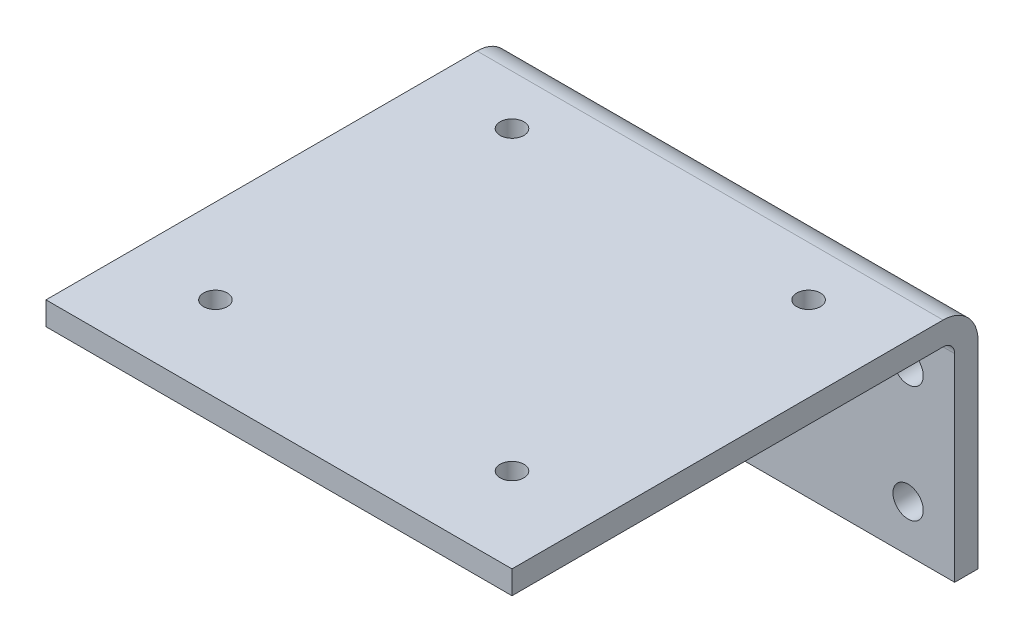
ISO-10303-21;
HEADER;
FILE_DESCRIPTION(('STEP AP214'),'2;1');
FILE_NAME('part.step','',(''),(''),'','','');
FILE_SCHEMA(('AUTOMOTIVE_DESIGN { 1 0 10303 214 1 1 1 1 }'));
ENDSEC;
DATA;
#1=APPLICATION_CONTEXT('core data for automotive mechanical design processes');
#2=APPLICATION_PROTOCOL_DEFINITION('international standard','automotive_design',2000,#1);
#3=PRODUCT_CONTEXT('',#1,'mechanical');
#4=PRODUCT('Part','Part','',(#3));
#5=PRODUCT_RELATED_PRODUCT_CATEGORY('part','',(#4));
#6=PRODUCT_DEFINITION_FORMATION('','',#4);
#7=PRODUCT_DEFINITION_CONTEXT('part definition',#1,'design');
#8=PRODUCT_DEFINITION('design','',#6,#7);
#9=PRODUCT_DEFINITION_SHAPE('','',#8);
#10=(LENGTH_UNIT() NAMED_UNIT(*) SI_UNIT(.MILLI.,.METRE.));
#11=(NAMED_UNIT(*) PLANE_ANGLE_UNIT() SI_UNIT($,.RADIAN.));
#12=(NAMED_UNIT(*) SI_UNIT($,.STERADIAN.) SOLID_ANGLE_UNIT());
#13=UNCERTAINTY_MEASURE_WITH_UNIT(LENGTH_MEASURE(1.E-05),#10,'distance_accuracy_value','');
#14=(GEOMETRIC_REPRESENTATION_CONTEXT(3) GLOBAL_UNCERTAINTY_ASSIGNED_CONTEXT((#13)) GLOBAL_UNIT_ASSIGNED_CONTEXT((#10,
#11,#12)) REPRESENTATION_CONTEXT('',''));
#15=CARTESIAN_POINT('',(0.,0.,0.));
#16=DIRECTION('',(0.,0.,1.));
#17=DIRECTION('',(1.,0.,0.));
#18=AXIS2_PLACEMENT_3D('',#15,#16,#17);
#19=CARTESIAN_POINT('',(5.,50.,0.));
#20=DIRECTION('',(1.,0.,0.));
#21=DIRECTION('',(0.,0.,-1.));
#22=AXIS2_PLACEMENT_3D('',#19,#20,#21);
#23=PLANE('',#22);
#24=CARTESIAN_POINT('',(5.,85.,-85.));
#25=DIRECTION('',(1.,0.,0.));
#26=DIRECTION('',(0.,0.,-1.));
#27=AXIS2_PLACEMENT_3D('',#24,#25,#26);
#28=CIRCLE('',#27,5.);
#29=CARTESIAN_POINT('',(5.,85.,-90.));
#30=VERTEX_POINT('',#29);
#31=CARTESIAN_POINT('',(5.,90.,-85.));
#32=VERTEX_POINT('',#31);
#33=EDGE_CURVE('E219',#30,#32,#28,.T.);
#34=ORIENTED_EDGE('',*,*,#33,.T.);
#35=DIRECTION('',(0.,0.,-1.));
#36=VECTOR('',#35,1.);
#37=CARTESIAN_POINT('',(5.,90.,0.));
#38=LINE('',#37,#36);
#39=CARTESIAN_POINT('',(5.,90.,7.5));
#40=VERTEX_POINT('',#39);
#41=EDGE_CURVE('E215',#40,#32,#38,.T.);
#42=ORIENTED_EDGE('',*,*,#41,.F.);
#43=DIRECTION('',(0.,0.678280102733066,0.734803444627488));
#44=VECTOR('',#43,1.);
#45=CARTESIAN_POINT('',(5.,0.,-90.));
#46=LINE('',#45,#44);
#47=CARTESIAN_POINT('',(5.,0.,-90.));
#48=VERTEX_POINT('',#47);
#49=EDGE_CURVE('E86',#40,#48,#46,.F.);
#50=ORIENTED_EDGE('',*,*,#49,.T.);
#51=DIRECTION('',(0.,1.,0.));
#52=VECTOR('',#51,1.);
#53=CARTESIAN_POINT('',(5.,100.,-90.));
#54=LINE('',#53,#52);
#55=EDGE_CURVE('E80',#30,#48,#54,.F.);
#56=ORIENTED_EDGE('',*,*,#55,.F.);
#57=EDGE_LOOP('',(#34,#42,#50,#56));
#58=FACE_BOUND('',#57,.T.);
#59=ADVANCED_FACE('F17',(#58),#23,.T.);
#60=CARTESIAN_POINT('',(-5.,50.,0.));
#61=DIRECTION('',(1.,0.,0.));
#62=DIRECTION('',(0.,0.,-1.));
#63=AXIS2_PLACEMENT_3D('',#60,#61,#62);
#64=PLANE('',#63);
#65=DIRECTION('',(0.,0.678280102733066,0.734803444627488));
#66=VECTOR('',#65,1.);
#67=CARTESIAN_POINT('',(-5.,0.,-90.));
#68=LINE('',#67,#66);
#69=CARTESIAN_POINT('',(-5.,0.,-90.));
#70=VERTEX_POINT('',#69);
#71=CARTESIAN_POINT('',(-5.,90.,7.5));
#72=VERTEX_POINT('',#71);
#73=EDGE_CURVE('E233',#70,#72,#68,.T.);
#74=ORIENTED_EDGE('',*,*,#73,.T.);
#75=DIRECTION('',(0.,0.,-1.));
#76=VECTOR('',#75,1.);
#77=CARTESIAN_POINT('',(-5.,90.,0.));
#78=LINE('',#77,#76);
#79=CARTESIAN_POINT('',(-5.,90.,-85.));
#80=VERTEX_POINT('',#79);
#81=EDGE_CURVE('E214',#80,#72,#78,.F.);
#82=ORIENTED_EDGE('',*,*,#81,.F.);
#83=CARTESIAN_POINT('',(-5.,85.,-85.));
#84=DIRECTION('',(1.,0.,0.));
#85=DIRECTION('',(0.,0.,-1.));
#86=AXIS2_PLACEMENT_3D('',#83,#84,#85);
#87=CIRCLE('',#86,5.);
#88=CARTESIAN_POINT('',(-5.,85.,-90.));
#89=VERTEX_POINT('',#88);
#90=EDGE_CURVE('E202',#80,#89,#87,.F.);
#91=ORIENTED_EDGE('',*,*,#90,.T.);
#92=DIRECTION('',(0.,1.,0.));
#93=VECTOR('',#92,1.);
#94=CARTESIAN_POINT('',(-5.,100.,-90.));
#95=LINE('',#94,#93);
#96=EDGE_CURVE('E200',#70,#89,#95,.T.);
#97=ORIENTED_EDGE('',*,*,#96,.F.);
#98=EDGE_LOOP('',(#74,#82,#91,#97));
#99=FACE_BOUND('',#98,.T.);
#100=ADVANCED_FACE('F321',(#99),#64,.F.);
#101=CARTESIAN_POINT('',(0.,0.,-90.));
#102=DIRECTION('',(0.,0.734803444627488,-0.678280102733066));
#103=DIRECTION('',(0.,0.678280102733066,0.734803444627488));
#104=AXIS2_PLACEMENT_3D('',#101,#102,#103);
#105=PLANE('',#104);
#106=DIRECTION('',(1.,0.,0.));
#107=VECTOR('',#106,1.);
#108=CARTESIAN_POINT('',(0.,0.,-90.));
#109=LINE('',#108,#107);
#110=EDGE_CURVE('E194',#48,#70,#109,.F.);
#111=ORIENTED_EDGE('',*,*,#110,.F.);
#112=ORIENTED_EDGE('',*,*,#49,.F.);
#113=DIRECTION('',(1.,0.,0.));
#114=VECTOR('',#113,1.);
#115=CARTESIAN_POINT('',(0.,90.,7.5));
#116=LINE('',#115,#114);
#117=EDGE_CURVE('E203',#72,#40,#116,.T.);
#118=ORIENTED_EDGE('',*,*,#117,.F.);
#119=ORIENTED_EDGE('',*,*,#73,.F.);
#120=EDGE_LOOP('',(#111,#112,#118,#119));
#121=FACE_BOUND('',#120,.T.);
#122=ADVANCED_FACE('F309',(#121),#105,.F.);
#123=CARTESIAN_POINT('',(80.,70.,-90.));
#124=DIRECTION('',(0.,0.,1.));
#125=DIRECTION('',(1.,0.,0.));
#126=AXIS2_PLACEMENT_3D('',#123,#124,#125);
#127=CYLINDRICAL_SURFACE('',#126,6.5);
#128=CARTESIAN_POINT('',(80.,70.,-100.));
#129=DIRECTION('',(0.,0.,1.));
#130=DIRECTION('',(1.,0.,0.));
#131=AXIS2_PLACEMENT_3D('',#128,#129,#130);
#132=CIRCLE('',#131,6.5);
#133=CARTESIAN_POINT('',(86.5,70.,-100.));
#134=VERTEX_POINT('',#133);
#135=EDGE_CURVE('E193',#134,#134,#132,.F.);
#136=ORIENTED_EDGE('',*,*,#135,.T.);
#137=EDGE_LOOP('',(#136));
#138=FACE_BOUND('',#137,.T.);
#139=CARTESIAN_POINT('',(80.,70.,-90.));
#140=DIRECTION('',(0.,0.,1.));
#141=DIRECTION('',(1.,0.,0.));
#142=AXIS2_PLACEMENT_3D('',#139,#140,#141);
#143=CIRCLE('',#142,6.5);
#144=CARTESIAN_POINT('',(86.5,70.,-90.));
#145=VERTEX_POINT('',#144);
#146=EDGE_CURVE('E20',#145,#145,#143,.F.);
#147=ORIENTED_EDGE('',*,*,#146,.F.);
#148=EDGE_LOOP('',(#147));
#149=FACE_BOUND('',#148,.T.);
#150=ADVANCED_FACE('F306',(#138,#149),#127,.F.);
#151=CARTESIAN_POINT('',(80.,20.,-90.));
#152=DIRECTION('',(0.,0.,1.));
#153=DIRECTION('',(1.,0.,0.));
#154=AXIS2_PLACEMENT_3D('',#151,#152,#153);
#155=CYLINDRICAL_SURFACE('',#154,6.5);
#156=CARTESIAN_POINT('',(80.,20.,-100.));
#157=DIRECTION('',(0.,0.,1.));
#158=DIRECTION('',(1.,0.,0.));
#159=AXIS2_PLACEMENT_3D('',#156,#157,#158);
#160=CIRCLE('',#159,6.5);
#161=CARTESIAN_POINT('',(86.5,20.,-100.));
#162=VERTEX_POINT('',#161);
#163=EDGE_CURVE('E181',#162,#162,#160,.F.);
#164=ORIENTED_EDGE('',*,*,#163,.T.);
#165=EDGE_LOOP('',(#164));
#166=FACE_BOUND('',#165,.T.);
#167=CARTESIAN_POINT('',(80.,20.,-90.));
#168=DIRECTION('',(0.,0.,1.));
#169=DIRECTION('',(1.,0.,0.));
#170=AXIS2_PLACEMENT_3D('',#167,#168,#169);
#171=CIRCLE('',#170,6.5);
#172=CARTESIAN_POINT('',(86.5,20.,-90.));
#173=VERTEX_POINT('',#172);
#174=EDGE_CURVE('E220',#173,#173,#171,.F.);
#175=ORIENTED_EDGE('',*,*,#174,.F.);
#176=EDGE_LOOP('',(#175));
#177=FACE_BOUND('',#176,.T.);
#178=ADVANCED_FACE('F308',(#166,#177),#155,.F.);
#179=CARTESIAN_POINT('',(-80.,20.,-90.));
#180=DIRECTION('',(0.,0.,1.));
#181=DIRECTION('',(1.,0.,0.));
#182=AXIS2_PLACEMENT_3D('',#179,#180,#181);
#183=CYLINDRICAL_SURFACE('',#182,6.5);
#184=CARTESIAN_POINT('',(-80.,20.,-100.));
#185=DIRECTION('',(0.,0.,1.));
#186=DIRECTION('',(1.,0.,0.));
#187=AXIS2_PLACEMENT_3D('',#184,#185,#186);
#188=CIRCLE('',#187,6.5);
#189=CARTESIAN_POINT('',(-73.5,20.,-100.));
#190=VERTEX_POINT('',#189);
#191=EDGE_CURVE('E180',#190,#190,#188,.F.);
#192=ORIENTED_EDGE('',*,*,#191,.T.);
#193=EDGE_LOOP('',(#192));
#194=FACE_BOUND('',#193,.T.);
#195=CARTESIAN_POINT('',(-80.,20.,-90.));
#196=DIRECTION('',(0.,0.,1.));
#197=DIRECTION('',(1.,0.,0.));
#198=AXIS2_PLACEMENT_3D('',#195,#196,#197);
#199=CIRCLE('',#198,6.5);
#200=CARTESIAN_POINT('',(-73.5,20.,-90.));
#201=VERTEX_POINT('',#200);
#202=EDGE_CURVE('E292',#201,#201,#199,.F.);
#203=ORIENTED_EDGE('',*,*,#202,.F.);
#204=EDGE_LOOP('',(#203));
#205=FACE_BOUND('',#204,.T.);
#206=ADVANCED_FACE('F318',(#194,#205),#183,.F.);
#207=CARTESIAN_POINT('',(-80.,70.,-90.));
#208=DIRECTION('',(0.,0.,1.));
#209=DIRECTION('',(1.,0.,0.));
#210=AXIS2_PLACEMENT_3D('',#207,#208,#209);
#211=CYLINDRICAL_SURFACE('',#210,6.5);
#212=CARTESIAN_POINT('',(-80.,70.,-100.));
#213=DIRECTION('',(0.,0.,1.));
#214=DIRECTION('',(1.,0.,0.));
#215=AXIS2_PLACEMENT_3D('',#212,#213,#214);
#216=CIRCLE('',#215,6.5);
#217=CARTESIAN_POINT('',(-73.5,70.,-100.));
#218=VERTEX_POINT('',#217);
#219=EDGE_CURVE('E281',#218,#218,#216,.F.);
#220=ORIENTED_EDGE('',*,*,#219,.T.);
#221=EDGE_LOOP('',(#220));
#222=FACE_BOUND('',#221,.T.);
#223=CARTESIAN_POINT('',(-80.,70.,-90.));
#224=DIRECTION('',(0.,0.,1.));
#225=DIRECTION('',(1.,0.,0.));
#226=AXIS2_PLACEMENT_3D('',#223,#224,#225);
#227=CIRCLE('',#226,6.5);
#228=CARTESIAN_POINT('',(-73.5,70.,-90.));
#229=VERTEX_POINT('',#228);
#230=EDGE_CURVE('E226',#229,#229,#227,.F.);
#231=ORIENTED_EDGE('',*,*,#230,.F.);
#232=EDGE_LOOP('',(#231));
#233=FACE_BOUND('',#232,.T.);
#234=ADVANCED_FACE('F383',(#222,#233),#211,.F.);
#235=CARTESIAN_POINT('',(-100.,100.,-90.));
#236=DIRECTION('',(0.,0.,1.));
#237=DIRECTION('',(1.,0.,0.));
#238=AXIS2_PLACEMENT_3D('',#235,#236,#237);
#239=PLANE('',#238);
#240=ORIENTED_EDGE('',*,*,#174,.T.);
#241=EDGE_LOOP('',(#240));
#242=FACE_BOUND('',#241,.T.);
#243=ORIENTED_EDGE('',*,*,#146,.T.);
#244=EDGE_LOOP('',(#243));
#245=FACE_BOUND('',#244,.T.);
#246=DIRECTION('',(0.,1.,0.));
#247=VECTOR('',#246,1.);
#248=CARTESIAN_POINT('',(100.,100.,-90.));
#249=LINE('',#248,#247);
#250=CARTESIAN_POINT('',(100.,0.,-90.));
#251=VERTEX_POINT('',#250);
#252=CARTESIAN_POINT('',(100.,85.,-90.));
#253=VERTEX_POINT('',#252);
#254=EDGE_CURVE('E168',#251,#253,#249,.T.);
#255=ORIENTED_EDGE('',*,*,#254,.T.);
#256=DIRECTION('',(1.,0.,0.));
#257=VECTOR('',#256,1.);
#258=CARTESIAN_POINT('',(-100.,85.,-90.));
#259=LINE('',#258,#257);
#260=EDGE_CURVE('E216',#253,#30,#259,.F.);
#261=ORIENTED_EDGE('',*,*,#260,.T.);
#262=ORIENTED_EDGE('',*,*,#55,.T.);
#263=DIRECTION('',(1.,0.,0.));
#264=VECTOR('',#263,1.);
#265=CARTESIAN_POINT('',(0.,0.,-90.));
#266=LINE('',#265,#264);
#267=EDGE_CURVE('E199',#251,#48,#266,.F.);
#268=ORIENTED_EDGE('',*,*,#267,.F.);
#269=EDGE_LOOP('',(#255,#261,#262,#268));
#270=FACE_BOUND('',#269,.T.);
#271=ADVANCED_FACE('F303',(#242,#245,#270),#239,.T.);
#272=CARTESIAN_POINT('',(-100.,85.,-85.));
#273=DIRECTION('',(1.,0.,0.));
#274=DIRECTION('',(0.,0.,-1.));
#275=AXIS2_PLACEMENT_3D('',#272,#273,#274);
#276=CYLINDRICAL_SURFACE('',#275,5.);
#277=ORIENTED_EDGE('',*,*,#33,.F.);
#278=ORIENTED_EDGE('',*,*,#260,.F.);
#279=CARTESIAN_POINT('',(100.,85.,-85.));
#280=DIRECTION('',(1.,0.,0.));
#281=DIRECTION('',(0.,0.,-1.));
#282=AXIS2_PLACEMENT_3D('',#279,#280,#281);
#283=CIRCLE('',#282,5.);
#284=CARTESIAN_POINT('',(100.,90.,-85.));
#285=VERTEX_POINT('',#284);
#286=EDGE_CURVE('E165',#253,#285,#283,.T.);
#287=ORIENTED_EDGE('',*,*,#286,.T.);
#288=DIRECTION('',(1.,0.,0.));
#289=VECTOR('',#288,1.);
#290=CARTESIAN_POINT('',(0.,90.,-85.));
#291=LINE('',#290,#289);
#292=EDGE_CURVE('E212',#32,#285,#291,.T.);
#293=ORIENTED_EDGE('',*,*,#292,.F.);
#294=EDGE_LOOP('',(#277,#278,#287,#293));
#295=FACE_BOUND('',#294,.T.);
#296=ADVANCED_FACE('F377',(#295),#276,.F.);
#297=CARTESIAN_POINT('',(0.,90.,0.));
#298=DIRECTION('',(0.,-1.,0.));
#299=DIRECTION('',(0.,0.,-1.));
#300=AXIS2_PLACEMENT_3D('',#297,#298,#299);
#301=PLANE('',#300);
#302=ORIENTED_EDGE('',*,*,#81,.T.);
#303=ORIENTED_EDGE('',*,*,#117,.T.);
#304=ORIENTED_EDGE('',*,*,#41,.T.);
#305=ORIENTED_EDGE('',*,*,#292,.T.);
#306=DIRECTION('',(0.,0.,1.));
#307=VECTOR('',#306,1.);
#308=CARTESIAN_POINT('',(100.,90.,100.));
#309=LINE('',#308,#307);
#310=CARTESIAN_POINT('',(100.,90.,100.));
#311=VERTEX_POINT('',#310);
#312=EDGE_CURVE('E120',#285,#311,#309,.T.);
#313=ORIENTED_EDGE('',*,*,#312,.T.);
#314=DIRECTION('',(-1.,0.,0.));
#315=VECTOR('',#314,1.);
#316=CARTESIAN_POINT('',(-100.,90.,100.));
#317=LINE('',#316,#315);
#318=CARTESIAN_POINT('',(-100.,90.,100.));
#319=VERTEX_POINT('',#318);
#320=EDGE_CURVE('E113',#311,#319,#317,.T.);
#321=ORIENTED_EDGE('',*,*,#320,.T.);
#322=DIRECTION('',(0.,0.,-1.));
#323=VECTOR('',#322,1.);
#324=CARTESIAN_POINT('',(-100.,90.,100.));
#325=LINE('',#324,#323);
#326=CARTESIAN_POINT('',(-100.,90.,-85.));
#327=VERTEX_POINT('',#326);
#328=EDGE_CURVE('E118',#319,#327,#325,.T.);
#329=ORIENTED_EDGE('',*,*,#328,.T.);
#330=DIRECTION('',(1.,0.,0.));
#331=VECTOR('',#330,1.);
#332=CARTESIAN_POINT('',(-100.,90.,-85.));
#333=LINE('',#332,#331);
#334=EDGE_CURVE('E201',#327,#80,#333,.T.);
#335=ORIENTED_EDGE('',*,*,#334,.T.);
#336=EDGE_LOOP('',(#302,#303,#304,#305,#313,#321,#329,#335));
#337=FACE_BOUND('',#336,.T.);
#338=CARTESIAN_POINT('',(-63.6396103067894,90.,63.6396103067892));
#339=DIRECTION('',(0.,1.,0.));
#340=DIRECTION('',(0.,0.,1.));
#341=AXIS2_PLACEMENT_3D('',#338,#339,#340);
#342=CIRCLE('',#341,5.1);
#343=CARTESIAN_POINT('',(-63.6396103067894,90.,68.7396103067892));
#344=VERTEX_POINT('',#343);
#345=EDGE_CURVE('E209',#344,#344,#342,.T.);
#346=ORIENTED_EDGE('',*,*,#345,.T.);
#347=EDGE_LOOP('',(#346));
#348=FACE_BOUND('',#347,.T.);
#349=CARTESIAN_POINT('',(63.6396103067894,90.,63.6396103067892));
#350=DIRECTION('',(0.,1.,0.));
#351=DIRECTION('',(0.,0.,1.));
#352=AXIS2_PLACEMENT_3D('',#349,#350,#351);
#353=CIRCLE('',#352,5.1);
#354=CARTESIAN_POINT('',(63.6396103067894,90.,68.7396103067892));
#355=VERTEX_POINT('',#354);
#356=EDGE_CURVE('E272',#355,#355,#353,.T.);
#357=ORIENTED_EDGE('',*,*,#356,.T.);
#358=EDGE_LOOP('',(#357));
#359=FACE_BOUND('',#358,.T.);
#360=CARTESIAN_POINT('',(63.6396103067894,90.,-63.6396103067892));
#361=DIRECTION('',(0.,1.,0.));
#362=DIRECTION('',(0.,0.,1.));
#363=AXIS2_PLACEMENT_3D('',#360,#361,#362);
#364=CIRCLE('',#363,5.1);
#365=CARTESIAN_POINT('',(63.6396103067894,90.,-58.5396103067892));
#366=VERTEX_POINT('',#365);
#367=EDGE_CURVE('E275',#366,#366,#364,.T.);
#368=ORIENTED_EDGE('',*,*,#367,.T.);
#369=EDGE_LOOP('',(#368));
#370=FACE_BOUND('',#369,.T.);
#371=CARTESIAN_POINT('',(-63.6396103067898,90.,-63.6396103067887));
#372=DIRECTION('',(0.,1.,0.));
#373=DIRECTION('',(0.,0.,1.));
#374=AXIS2_PLACEMENT_3D('',#371,#372,#373);
#375=CIRCLE('',#374,5.1);
#376=CARTESIAN_POINT('',(-63.6396103067898,90.,-58.5396103067887));
#377=VERTEX_POINT('',#376);
#378=EDGE_CURVE('E278',#377,#377,#375,.T.);
#379=ORIENTED_EDGE('',*,*,#378,.T.);
#380=EDGE_LOOP('',(#379));
#381=FACE_BOUND('',#380,.T.);
#382=ADVANCED_FACE('F115',(#337,#348,#359,#370,#381),#301,.T.);
#383=CARTESIAN_POINT('',(-100.,85.,-85.));
#384=DIRECTION('',(1.,0.,0.));
#385=DIRECTION('',(0.,0.,-1.));
#386=AXIS2_PLACEMENT_3D('',#383,#384,#385);
#387=CYLINDRICAL_SURFACE('',#386,5.);
#388=ORIENTED_EDGE('',*,*,#334,.F.);
#389=CARTESIAN_POINT('',(-100.,85.,-85.));
#390=DIRECTION('',(1.,0.,0.));
#391=DIRECTION('',(0.,0.,-1.));
#392=AXIS2_PLACEMENT_3D('',#389,#390,#391);
#393=CIRCLE('',#392,5.);
#394=CARTESIAN_POINT('',(-100.,85.,-90.));
#395=VERTEX_POINT('',#394);
#396=EDGE_CURVE('E134',#327,#395,#393,.F.);
#397=ORIENTED_EDGE('',*,*,#396,.T.);
#398=DIRECTION('',(1.,0.,0.));
#399=VECTOR('',#398,1.);
#400=CARTESIAN_POINT('',(-100.,85.,-90.));
#401=LINE('',#400,#399);
#402=EDGE_CURVE('E197',#89,#395,#401,.F.);
#403=ORIENTED_EDGE('',*,*,#402,.F.);
#404=ORIENTED_EDGE('',*,*,#90,.F.);
#405=EDGE_LOOP('',(#388,#397,#403,#404));
#406=FACE_BOUND('',#405,.T.);
#407=ADVANCED_FACE('F370',(#406),#387,.F.);
#408=CARTESIAN_POINT('',(-100.,100.,-90.));
#409=DIRECTION('',(0.,0.,1.));
#410=DIRECTION('',(1.,0.,0.));
#411=AXIS2_PLACEMENT_3D('',#408,#409,#410);
#412=PLANE('',#411);
#413=ORIENTED_EDGE('',*,*,#402,.T.);
#414=DIRECTION('',(0.,1.,0.));
#415=VECTOR('',#414,1.);
#416=CARTESIAN_POINT('',(-100.,100.,-90.));
#417=LINE('',#416,#415);
#418=CARTESIAN_POINT('',(-100.,0.,-90.));
#419=VERTEX_POINT('',#418);
#420=EDGE_CURVE('E188',#395,#419,#417,.F.);
#421=ORIENTED_EDGE('',*,*,#420,.T.);
#422=DIRECTION('',(1.,0.,0.));
#423=VECTOR('',#422,1.);
#424=CARTESIAN_POINT('',(0.,0.,-90.));
#425=LINE('',#424,#423);
#426=EDGE_CURVE('E191',#70,#419,#425,.F.);
#427=ORIENTED_EDGE('',*,*,#426,.F.);
#428=ORIENTED_EDGE('',*,*,#96,.T.);
#429=EDGE_LOOP('',(#413,#421,#427,#428));
#430=FACE_BOUND('',#429,.T.);
#431=ORIENTED_EDGE('',*,*,#230,.T.);
#432=EDGE_LOOP('',(#431));
#433=FACE_BOUND('',#432,.T.);
#434=ORIENTED_EDGE('',*,*,#202,.T.);
#435=EDGE_LOOP('',(#434));
#436=FACE_BOUND('',#435,.T.);
#437=ADVANCED_FACE('F366',(#430,#433,#436),#412,.T.);
#438=CARTESIAN_POINT('',(0.,0.,0.));
#439=DIRECTION('',(0.,-1.,0.));
#440=DIRECTION('',(0.,0.,-1.));
#441=AXIS2_PLACEMENT_3D('',#438,#439,#440);
#442=PLANE('',#441);
#443=DIRECTION('',(1.,0.,0.));
#444=VECTOR('',#443,1.);
#445=CARTESIAN_POINT('',(-100.,0.,-100.));
#446=LINE('',#445,#444);
#447=CARTESIAN_POINT('',(-100.,0.,-100.));
#448=VERTEX_POINT('',#447);
#449=CARTESIAN_POINT('',(100.,0.,-100.));
#450=VERTEX_POINT('',#449);
#451=EDGE_CURVE('E177',#448,#450,#446,.T.);
#452=ORIENTED_EDGE('',*,*,#451,.T.);
#453=DIRECTION('',(0.,0.,1.));
#454=VECTOR('',#453,1.);
#455=CARTESIAN_POINT('',(100.,0.,100.));
#456=LINE('',#455,#454);
#457=EDGE_CURVE('E171',#450,#251,#456,.T.);
#458=ORIENTED_EDGE('',*,*,#457,.T.);
#459=ORIENTED_EDGE('',*,*,#267,.T.);
#460=ORIENTED_EDGE('',*,*,#110,.T.);
#461=ORIENTED_EDGE('',*,*,#426,.T.);
#462=DIRECTION('',(0.,0.,-1.));
#463=VECTOR('',#462,1.);
#464=CARTESIAN_POINT('',(-100.,0.,100.));
#465=LINE('',#464,#463);
#466=EDGE_CURVE('E184',#419,#448,#465,.T.);
#467=ORIENTED_EDGE('',*,*,#466,.T.);
#468=EDGE_LOOP('',(#452,#458,#459,#460,#461,#467));
#469=FACE_BOUND('',#468,.T.);
#470=ADVANCED_FACE('F362',(#469),#442,.T.);
#471=CARTESIAN_POINT('',(-100.,100.,-100.));
#472=DIRECTION('',(0.,0.,1.));
#473=DIRECTION('',(1.,0.,0.));
#474=AXIS2_PLACEMENT_3D('',#471,#472,#473);
#475=PLANE('',#474);
#476=ORIENTED_EDGE('',*,*,#219,.F.);
#477=EDGE_LOOP('',(#476));
#478=FACE_BOUND('',#477,.T.);
#479=ORIENTED_EDGE('',*,*,#191,.F.);
#480=EDGE_LOOP('',(#479));
#481=FACE_BOUND('',#480,.T.);
#482=DIRECTION('',(0.,1.,0.));
#483=VECTOR('',#482,1.);
#484=CARTESIAN_POINT('',(-100.,100.,-100.));
#485=LINE('',#484,#483);
#486=CARTESIAN_POINT('',(-100.,85.,-100.));
#487=VERTEX_POINT('',#486);
#488=EDGE_CURVE('E187',#448,#487,#485,.T.);
#489=ORIENTED_EDGE('',*,*,#488,.T.);
#490=DIRECTION('',(-1.,0.,0.));
#491=VECTOR('',#490,1.);
#492=CARTESIAN_POINT('',(0.,85.,-100.));
#493=LINE('',#492,#491);
#494=CARTESIAN_POINT('',(100.,85.,-100.));
#495=VERTEX_POINT('',#494);
#496=EDGE_CURVE('E174',#495,#487,#493,.T.);
#497=ORIENTED_EDGE('',*,*,#496,.F.);
#498=DIRECTION('',(0.,1.,0.));
#499=VECTOR('',#498,1.);
#500=CARTESIAN_POINT('',(100.,100.,-100.));
#501=LINE('',#500,#499);
#502=EDGE_CURVE('E152',#495,#450,#501,.F.);
#503=ORIENTED_EDGE('',*,*,#502,.T.);
#504=ORIENTED_EDGE('',*,*,#451,.F.);
#505=EDGE_LOOP('',(#489,#497,#503,#504));
#506=FACE_BOUND('',#505,.T.);
#507=ORIENTED_EDGE('',*,*,#163,.F.);
#508=EDGE_LOOP('',(#507));
#509=FACE_BOUND('',#508,.T.);
#510=ORIENTED_EDGE('',*,*,#135,.F.);
#511=EDGE_LOOP('',(#510));
#512=FACE_BOUND('',#511,.T.);
#513=ADVANCED_FACE('F358',(#478,#481,#506,#509,#512),#475,.F.);
#514=CARTESIAN_POINT('',(-63.6396103067898,100.,-63.6396103067887));
#515=DIRECTION('',(0.,1.,0.));
#516=DIRECTION('',(0.,0.,1.));
#517=AXIS2_PLACEMENT_3D('',#514,#515,#516);
#518=CYLINDRICAL_SURFACE('',#517,5.1);
#519=ORIENTED_EDGE('',*,*,#378,.F.);
#520=EDGE_LOOP('',(#519));
#521=FACE_BOUND('',#520,.T.);
#522=CARTESIAN_POINT('',(-63.6396103067898,100.,-63.6396103067887));
#523=DIRECTION('',(0.,1.,0.));
#524=DIRECTION('',(0.,0.,1.));
#525=AXIS2_PLACEMENT_3D('',#522,#523,#524);
#526=CIRCLE('',#525,5.1);
#527=CARTESIAN_POINT('',(-63.6396103067898,100.,-58.5396103067887));
#528=VERTEX_POINT('',#527);
#529=EDGE_CURVE('E261',#528,#528,#526,.T.);
#530=ORIENTED_EDGE('',*,*,#529,.T.);
#531=EDGE_LOOP('',(#530));
#532=FACE_BOUND('',#531,.T.);
#533=ADVANCED_FACE('F354',(#521,#532),#518,.F.);
#534=CARTESIAN_POINT('',(63.6396103067894,100.,-63.6396103067892));
#535=DIRECTION('',(0.,1.,0.));
#536=DIRECTION('',(0.,0.,1.));
#537=AXIS2_PLACEMENT_3D('',#534,#535,#536);
#538=CYLINDRICAL_SURFACE('',#537,5.1);
#539=ORIENTED_EDGE('',*,*,#367,.F.);
#540=EDGE_LOOP('',(#539));
#541=FACE_BOUND('',#540,.T.);
#542=CARTESIAN_POINT('',(63.6396103067894,100.,-63.6396103067892));
#543=DIRECTION('',(0.,1.,0.));
#544=DIRECTION('',(0.,0.,1.));
#545=AXIS2_PLACEMENT_3D('',#542,#543,#544);
#546=CIRCLE('',#545,5.1);
#547=CARTESIAN_POINT('',(63.6396103067894,100.,-58.5396103067892));
#548=VERTEX_POINT('',#547);
#549=EDGE_CURVE('E258',#548,#548,#546,.T.);
#550=ORIENTED_EDGE('',*,*,#549,.T.);
#551=EDGE_LOOP('',(#550));
#552=FACE_BOUND('',#551,.T.);
#553=ADVANCED_FACE('F350',(#541,#552),#538,.F.);
#554=CARTESIAN_POINT('',(63.6396103067894,100.,63.6396103067892));
#555=DIRECTION('',(0.,1.,0.));
#556=DIRECTION('',(0.,0.,1.));
#557=AXIS2_PLACEMENT_3D('',#554,#555,#556);
#558=CYLINDRICAL_SURFACE('',#557,5.1);
#559=ORIENTED_EDGE('',*,*,#356,.F.);
#560=EDGE_LOOP('',(#559));
#561=FACE_BOUND('',#560,.T.);
#562=CARTESIAN_POINT('',(63.6396103067894,100.,63.6396103067892));
#563=DIRECTION('',(0.,1.,0.));
#564=DIRECTION('',(0.,0.,1.));
#565=AXIS2_PLACEMENT_3D('',#562,#563,#564);
#566=CIRCLE('',#565,5.1);
#567=CARTESIAN_POINT('',(63.6396103067894,100.,68.7396103067892));
#568=VERTEX_POINT('',#567);
#569=EDGE_CURVE('E255',#568,#568,#566,.T.);
#570=ORIENTED_EDGE('',*,*,#569,.T.);
#571=EDGE_LOOP('',(#570));
#572=FACE_BOUND('',#571,.T.);
#573=ADVANCED_FACE('F346',(#561,#572),#558,.F.);
#574=CARTESIAN_POINT('',(-63.6396103067894,100.,63.6396103067892));
#575=DIRECTION('',(0.,1.,0.));
#576=DIRECTION('',(0.,0.,1.));
#577=AXIS2_PLACEMENT_3D('',#574,#575,#576);
#578=CYLINDRICAL_SURFACE('',#577,5.1);
#579=ORIENTED_EDGE('',*,*,#345,.F.);
#580=EDGE_LOOP('',(#579));
#581=FACE_BOUND('',#580,.T.);
#582=CARTESIAN_POINT('',(-63.6396103067894,100.,63.6396103067892));
#583=DIRECTION('',(0.,1.,0.));
#584=DIRECTION('',(0.,0.,1.));
#585=AXIS2_PLACEMENT_3D('',#582,#583,#584);
#586=CIRCLE('',#585,5.1);
#587=CARTESIAN_POINT('',(-63.6396103067894,100.,68.7396103067892));
#588=VERTEX_POINT('',#587);
#589=EDGE_CURVE('E157',#588,#588,#586,.T.);
#590=ORIENTED_EDGE('',*,*,#589,.T.);
#591=EDGE_LOOP('',(#590));
#592=FACE_BOUND('',#591,.T.);
#593=ADVANCED_FACE('F342',(#581,#592),#578,.F.);
#594=CARTESIAN_POINT('',(100.,100.,100.));
#595=DIRECTION('',(-1.,0.,0.));
#596=DIRECTION('',(0.,0.,1.));
#597=AXIS2_PLACEMENT_3D('',#594,#595,#596);
#598=PLANE('',#597);
#599=CARTESIAN_POINT('',(100.,85.,-85.));
#600=DIRECTION('',(-1.,0.,0.));
#601=DIRECTION('',(0.,0.,1.));
#602=AXIS2_PLACEMENT_3D('',#599,#600,#601);
#603=CIRCLE('',#602,15.);
#604=CARTESIAN_POINT('',(100.,100.,-85.));
#605=VERTEX_POINT('',#604);
#606=EDGE_CURVE('E176',#605,#495,#603,.T.);
#607=ORIENTED_EDGE('',*,*,#606,.F.);
#608=DIRECTION('',(0.,0.,-1.));
#609=VECTOR('',#608,1.);
#610=CARTESIAN_POINT('',(100.,100.,0.));
#611=LINE('',#610,#609);
#612=CARTESIAN_POINT('',(100.,100.,100.));
#613=VERTEX_POINT('',#612);
#614=EDGE_CURVE('E148',#605,#613,#611,.F.);
#615=ORIENTED_EDGE('',*,*,#614,.T.);
#616=DIRECTION('',(0.,1.,0.));
#617=VECTOR('',#616,1.);
#618=CARTESIAN_POINT('',(100.,100.,100.));
#619=LINE('',#618,#617);
#620=EDGE_CURVE('E125',#613,#311,#619,.F.);
#621=ORIENTED_EDGE('',*,*,#620,.T.);
#622=ORIENTED_EDGE('',*,*,#312,.F.);
#623=ORIENTED_EDGE('',*,*,#286,.F.);
#624=ORIENTED_EDGE('',*,*,#254,.F.);
#625=ORIENTED_EDGE('',*,*,#457,.F.);
#626=ORIENTED_EDGE('',*,*,#502,.F.);
#627=EDGE_LOOP('',(#607,#615,#621,#622,#623,#624,#625,#626));
#628=FACE_BOUND('',#627,.T.);
#629=ADVANCED_FACE('F339',(#628),#598,.F.);
#630=CARTESIAN_POINT('',(-100.,100.,100.));
#631=DIRECTION('',(0.,0.,-1.));
#632=DIRECTION('',(-1.,0.,0.));
#633=AXIS2_PLACEMENT_3D('',#630,#631,#632);
#634=PLANE('',#633);
#635=ORIENTED_EDGE('',*,*,#320,.F.);
#636=ORIENTED_EDGE('',*,*,#620,.F.);
#637=DIRECTION('',(1.,0.,0.));
#638=VECTOR('',#637,1.);
#639=CARTESIAN_POINT('',(0.,100.,100.));
#640=LINE('',#639,#638);
#641=CARTESIAN_POINT('',(-100.,100.,100.));
#642=VERTEX_POINT('',#641);
#643=EDGE_CURVE('E139',#613,#642,#640,.F.);
#644=ORIENTED_EDGE('',*,*,#643,.T.);
#645=DIRECTION('',(0.,1.,0.));
#646=VECTOR('',#645,1.);
#647=CARTESIAN_POINT('',(-100.,100.,100.));
#648=LINE('',#647,#646);
#649=EDGE_CURVE('E124',#642,#319,#648,.F.);
#650=ORIENTED_EDGE('',*,*,#649,.T.);
#651=EDGE_LOOP('',(#635,#636,#644,#650));
#652=FACE_BOUND('',#651,.T.);
#653=ADVANCED_FACE('F137',(#652),#634,.F.);
#654=CARTESIAN_POINT('',(-100.,100.,100.));
#655=DIRECTION('',(1.,0.,0.));
#656=DIRECTION('',(0.,0.,-1.));
#657=AXIS2_PLACEMENT_3D('',#654,#655,#656);
#658=PLANE('',#657);
#659=CARTESIAN_POINT('',(-100.,85.,-85.));
#660=DIRECTION('',(-1.,0.,0.));
#661=DIRECTION('',(0.,0.,1.));
#662=AXIS2_PLACEMENT_3D('',#659,#660,#661);
#663=CIRCLE('',#662,15.);
#664=CARTESIAN_POINT('',(-100.,100.,-85.));
#665=VERTEX_POINT('',#664);
#666=EDGE_CURVE('E34',#487,#665,#663,.F.);
#667=ORIENTED_EDGE('',*,*,#666,.F.);
#668=ORIENTED_EDGE('',*,*,#488,.F.);
#669=ORIENTED_EDGE('',*,*,#466,.F.);
#670=ORIENTED_EDGE('',*,*,#420,.F.);
#671=ORIENTED_EDGE('',*,*,#396,.F.);
#672=ORIENTED_EDGE('',*,*,#328,.F.);
#673=ORIENTED_EDGE('',*,*,#649,.F.);
#674=DIRECTION('',(0.,0.,-1.));
#675=VECTOR('',#674,1.);
#676=CARTESIAN_POINT('',(-100.,100.,0.));
#677=LINE('',#676,#675);
#678=EDGE_CURVE('E26',#642,#665,#677,.T.);
#679=ORIENTED_EDGE('',*,*,#678,.T.);
#680=EDGE_LOOP('',(#667,#668,#669,#670,#671,#672,#673,#679));
#681=FACE_BOUND('',#680,.T.);
#682=ADVANCED_FACE('F129',(#681),#658,.F.);
#683=CARTESIAN_POINT('',(0.,85.,-85.));
#684=DIRECTION('',(-1.,0.,0.));
#685=DIRECTION('',(0.,0.,1.));
#686=AXIS2_PLACEMENT_3D('',#683,#684,#685);
#687=CYLINDRICAL_SURFACE('',#686,15.);
#688=ORIENTED_EDGE('',*,*,#666,.T.);
#689=DIRECTION('',(1.,0.,0.));
#690=VECTOR('',#689,1.);
#691=CARTESIAN_POINT('',(0.,100.,-85.));
#692=LINE('',#691,#690);
#693=EDGE_CURVE('E11',#665,#605,#692,.T.);
#694=ORIENTED_EDGE('',*,*,#693,.T.);
#695=ORIENTED_EDGE('',*,*,#606,.T.);
#696=ORIENTED_EDGE('',*,*,#496,.T.);
#697=EDGE_LOOP('',(#688,#694,#695,#696));
#698=FACE_BOUND('',#697,.T.);
#699=ADVANCED_FACE('F325',(#698),#687,.T.);
#700=CARTESIAN_POINT('',(0.,100.,0.));
#701=DIRECTION('',(0.,-1.,0.));
#702=DIRECTION('',(0.,0.,-1.));
#703=AXIS2_PLACEMENT_3D('',#700,#701,#702);
#704=PLANE('',#703);
#705=ORIENTED_EDGE('',*,*,#678,.F.);
#706=ORIENTED_EDGE('',*,*,#643,.F.);
#707=ORIENTED_EDGE('',*,*,#614,.F.);
#708=ORIENTED_EDGE('',*,*,#693,.F.);
#709=EDGE_LOOP('',(#705,#706,#707,#708));
#710=FACE_BOUND('',#709,.T.);
#711=ORIENTED_EDGE('',*,*,#589,.F.);
#712=EDGE_LOOP('',(#711));
#713=FACE_BOUND('',#712,.T.);
#714=ORIENTED_EDGE('',*,*,#569,.F.);
#715=EDGE_LOOP('',(#714));
#716=FACE_BOUND('',#715,.T.);
#717=ORIENTED_EDGE('',*,*,#549,.F.);
#718=EDGE_LOOP('',(#717));
#719=FACE_BOUND('',#718,.T.);
#720=ORIENTED_EDGE('',*,*,#529,.F.);
#721=EDGE_LOOP('',(#720));
#722=FACE_BOUND('',#721,.T.);
#723=ADVANCED_FACE('F323',(#710,#713,#716,#719,#722),#704,.F.);
#724=CLOSED_SHELL('',(#59,#100,#122,#150,#178,#206,#234,#271,#296,#382,#407,#437,#470,#513,#533,
#553,#573,#593,#629,#653,#682,#699,#723));
#725=MANIFOLD_SOLID_BREP('B1',#724);
#726=ADVANCED_BREP_SHAPE_REPRESENTATION('',(#18,#725),#14);
#727=SHAPE_DEFINITION_REPRESENTATION(#9,#726);
ENDSEC;
END-ISO-10303-21;
